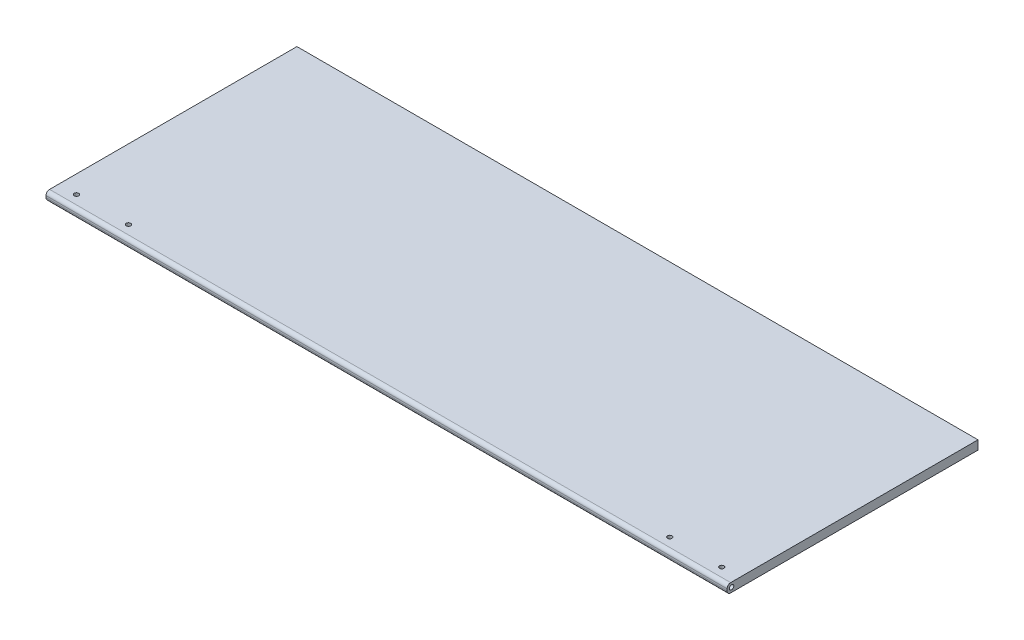
ISO-10303-21;
HEADER;
FILE_DESCRIPTION(('STEP AP214'),'2;1');
FILE_NAME('part.step','',(''),(''),'','','');
FILE_SCHEMA(('AUTOMOTIVE_DESIGN { 1 0 10303 214 1 1 1 1 }'));
ENDSEC;
DATA;
#1=APPLICATION_CONTEXT('core data for automotive mechanical design processes');
#2=APPLICATION_PROTOCOL_DEFINITION('international standard','automotive_design',2000,#1);
#3=PRODUCT_CONTEXT('',#1,'mechanical');
#4=PRODUCT('Part','Part','',(#3));
#5=PRODUCT_RELATED_PRODUCT_CATEGORY('part','',(#4));
#6=PRODUCT_DEFINITION_FORMATION('','',#4);
#7=PRODUCT_DEFINITION_CONTEXT('part definition',#1,'design');
#8=PRODUCT_DEFINITION('design','',#6,#7);
#9=PRODUCT_DEFINITION_SHAPE('','',#8);
#10=(LENGTH_UNIT() NAMED_UNIT(*) SI_UNIT(.MILLI.,.METRE.));
#11=(NAMED_UNIT(*) PLANE_ANGLE_UNIT() SI_UNIT($,.RADIAN.));
#12=(NAMED_UNIT(*) SI_UNIT($,.STERADIAN.) SOLID_ANGLE_UNIT());
#13=UNCERTAINTY_MEASURE_WITH_UNIT(LENGTH_MEASURE(1.E-05),#10,'distance_accuracy_value','');
#14=(GEOMETRIC_REPRESENTATION_CONTEXT(3) GLOBAL_UNCERTAINTY_ASSIGNED_CONTEXT((#13)) GLOBAL_UNIT_ASSIGNED_CONTEXT((#10,
#11,#12)) REPRESENTATION_CONTEXT('',''));
#15=CARTESIAN_POINT('',(0.,0.,0.));
#16=DIRECTION('',(0.,0.,1.));
#17=DIRECTION('',(1.,0.,0.));
#18=AXIS2_PLACEMENT_3D('',#15,#16,#17);
#19=CARTESIAN_POINT('',(60.325,3.96875,-22.8668008717622));
#20=DIRECTION('',(-1.,0.,0.));
#21=DIRECTION('',(0.,0.,1.));
#22=AXIS2_PLACEMENT_3D('',#19,#20,#21);
#23=PLANE('',#22);
#24=CARTESIAN_POINT('',(60.325,3.175,20.7894491282378));
#25=DIRECTION('',(-1.,0.,0.));
#26=DIRECTION('',(0.,0.,1.));
#27=AXIS2_PLACEMENT_3D('',#24,#25,#26);
#28=CIRCLE('',#27,0.396875);
#29=CARTESIAN_POINT('',(60.325,3.175,21.1863241282378));
#30=VERTEX_POINT('',#29);
#31=EDGE_CURVE('E140',#30,#30,#28,.T.);
#32=ORIENTED_EDGE('',*,*,#31,.T.);
#33=EDGE_LOOP('',(#32));
#34=FACE_BOUND('',#33,.T.);
#35=DIRECTION('',(0.,-1.,0.));
#36=VECTOR('',#35,1.);
#37=CARTESIAN_POINT('',(60.325,3.96875,21.5831991282378));
#38=LINE('',#37,#36);
#39=CARTESIAN_POINT('',(60.325,3.33375,21.5831991282378));
#40=VERTEX_POINT('',#39);
#41=CARTESIAN_POINT('',(60.325,3.01625,21.5831991282378));
#42=VERTEX_POINT('',#41);
#43=EDGE_CURVE('E136',#40,#42,#38,.T.);
#44=ORIENTED_EDGE('',*,*,#43,.T.);
#45=CARTESIAN_POINT('',(60.325,3.01625,20.9481991282378));
#46=DIRECTION('',(-1.,0.,0.));
#47=DIRECTION('',(0.,0.,1.));
#48=AXIS2_PLACEMENT_3D('',#45,#46,#47);
#49=CIRCLE('',#48,0.635);
#50=CARTESIAN_POINT('',(60.325,2.38125,20.9481991282378));
#51=VERTEX_POINT('',#50);
#52=EDGE_CURVE('E124',#42,#51,#49,.F.);
#53=ORIENTED_EDGE('',*,*,#52,.T.);
#54=DIRECTION('',(0.,0.,-1.));
#55=VECTOR('',#54,1.);
#56=CARTESIAN_POINT('',(60.325,2.38125,-22.8668008717622));
#57=LINE('',#56,#55);
#58=CARTESIAN_POINT('',(60.325,2.38125,-22.8668008717622));
#59=VERTEX_POINT('',#58);
#60=EDGE_CURVE('E110',#51,#59,#57,.T.);
#61=ORIENTED_EDGE('',*,*,#60,.T.);
#62=DIRECTION('',(0.,-1.,0.));
#63=VECTOR('',#62,1.);
#64=CARTESIAN_POINT('',(60.325,3.96875,-22.8668008717622));
#65=LINE('',#64,#63);
#66=CARTESIAN_POINT('',(60.325,3.96875,-22.8668008717622));
#67=VERTEX_POINT('',#66);
#68=EDGE_CURVE('E104',#67,#59,#65,.T.);
#69=ORIENTED_EDGE('',*,*,#68,.F.);
#70=DIRECTION('',(0.,0.,-1.));
#71=VECTOR('',#70,1.);
#72=CARTESIAN_POINT('',(60.325,3.96875,-22.8668008717622));
#73=LINE('',#72,#71);
#74=CARTESIAN_POINT('',(60.325,3.96875,20.9481991282378));
#75=VERTEX_POINT('',#74);
#76=EDGE_CURVE('E91',#75,#67,#73,.T.);
#77=ORIENTED_EDGE('',*,*,#76,.F.);
#78=CARTESIAN_POINT('',(60.325,3.33375,20.9481991282378));
#79=DIRECTION('',(-1.,0.,0.));
#80=DIRECTION('',(0.,0.,1.));
#81=AXIS2_PLACEMENT_3D('',#78,#79,#80);
#82=CIRCLE('',#81,0.635);
#83=EDGE_CURVE('E122',#75,#40,#82,.F.);
#84=ORIENTED_EDGE('',*,*,#83,.T.);
#85=EDGE_LOOP('',(#44,#53,#61,#69,#77,#84));
#86=FACE_BOUND('',#85,.T.);
#87=ADVANCED_FACE('F35',(#34,#86),#23,.F.);
#88=CARTESIAN_POINT('',(-60.325,3.96875,-22.8668008717622));
#89=DIRECTION('',(0.,0.,1.));
#90=DIRECTION('',(1.,0.,0.));
#91=AXIS2_PLACEMENT_3D('',#88,#89,#90);
#92=PLANE('',#91);
#93=DIRECTION('',(-1.,0.,0.));
#94=VECTOR('',#93,1.);
#95=CARTESIAN_POINT('',(-60.325,2.38125,-22.8668008717622));
#96=LINE('',#95,#94);
#97=CARTESIAN_POINT('',(-60.325,2.38125,-22.8668008717622));
#98=VERTEX_POINT('',#97);
#99=EDGE_CURVE('E139',#59,#98,#96,.T.);
#100=ORIENTED_EDGE('',*,*,#99,.T.);
#101=DIRECTION('',(0.,-1.,0.));
#102=VECTOR('',#101,1.);
#103=CARTESIAN_POINT('',(-60.325,3.96875,-22.8668008717622));
#104=LINE('',#103,#102);
#105=CARTESIAN_POINT('',(-60.325,3.96875,-22.8668008717622));
#106=VERTEX_POINT('',#105);
#107=EDGE_CURVE('E106',#106,#98,#104,.T.);
#108=ORIENTED_EDGE('',*,*,#107,.F.);
#109=DIRECTION('',(-1.,0.,0.));
#110=VECTOR('',#109,1.);
#111=CARTESIAN_POINT('',(-60.325,3.96875,-22.8668008717622));
#112=LINE('',#111,#110);
#113=EDGE_CURVE('E94',#67,#106,#112,.T.);
#114=ORIENTED_EDGE('',*,*,#113,.F.);
#115=ORIENTED_EDGE('',*,*,#68,.T.);
#116=EDGE_LOOP('',(#100,#108,#114,#115));
#117=FACE_BOUND('',#116,.T.);
#118=ADVANCED_FACE('F103',(#117),#92,.F.);
#119=CARTESIAN_POINT('',(-60.325,3.96875,-22.8668008717622));
#120=DIRECTION('',(1.,0.,0.));
#121=DIRECTION('',(0.,0.,-1.));
#122=AXIS2_PLACEMENT_3D('',#119,#120,#121);
#123=PLANE('',#122);
#124=CARTESIAN_POINT('',(-60.325,3.175,20.7894491282378));
#125=DIRECTION('',(-1.,0.,0.));
#126=DIRECTION('',(0.,0.,1.));
#127=AXIS2_PLACEMENT_3D('',#124,#125,#126);
#128=CIRCLE('',#127,0.396875);
#129=CARTESIAN_POINT('',(-60.325,3.175,21.1863241282378));
#130=VERTEX_POINT('',#129);
#131=EDGE_CURVE('E144',#130,#130,#128,.T.);
#132=ORIENTED_EDGE('',*,*,#131,.F.);
#133=EDGE_LOOP('',(#132));
#134=FACE_BOUND('',#133,.T.);
#135=DIRECTION('',(0.,0.,1.));
#136=VECTOR('',#135,1.);
#137=CARTESIAN_POINT('',(-60.325,2.38125,-22.8668008717622));
#138=LINE('',#137,#136);
#139=CARTESIAN_POINT('',(-60.325,2.38125,20.9481991282378));
#140=VERTEX_POINT('',#139);
#141=EDGE_CURVE('E99',#98,#140,#138,.T.);
#142=ORIENTED_EDGE('',*,*,#141,.T.);
#143=CARTESIAN_POINT('',(-60.325,3.01625,20.9481991282378));
#144=DIRECTION('',(1.,0.,0.));
#145=DIRECTION('',(0.,0.,-1.));
#146=AXIS2_PLACEMENT_3D('',#143,#144,#145);
#147=CIRCLE('',#146,0.635);
#148=CARTESIAN_POINT('',(-60.325,3.01625,21.5831991282378));
#149=VERTEX_POINT('',#148);
#150=EDGE_CURVE('E43',#140,#149,#147,.F.);
#151=ORIENTED_EDGE('',*,*,#150,.T.);
#152=DIRECTION('',(0.,-1.,0.));
#153=VECTOR('',#152,1.);
#154=CARTESIAN_POINT('',(-60.325,3.96875,21.5831991282378));
#155=LINE('',#154,#153);
#156=CARTESIAN_POINT('',(-60.325,3.33375,21.5831991282378));
#157=VERTEX_POINT('',#156);
#158=EDGE_CURVE('E116',#157,#149,#155,.T.);
#159=ORIENTED_EDGE('',*,*,#158,.F.);
#160=CARTESIAN_POINT('',(-60.325,3.33375,20.9481991282378));
#161=DIRECTION('',(1.,0.,0.));
#162=DIRECTION('',(0.,0.,-1.));
#163=AXIS2_PLACEMENT_3D('',#160,#161,#162);
#164=CIRCLE('',#163,0.635);
#165=CARTESIAN_POINT('',(-60.325,3.96875,20.9481991282378));
#166=VERTEX_POINT('',#165);
#167=EDGE_CURVE('E50',#157,#166,#164,.F.);
#168=ORIENTED_EDGE('',*,*,#167,.T.);
#169=DIRECTION('',(0.,0.,1.));
#170=VECTOR('',#169,1.);
#171=CARTESIAN_POINT('',(-60.325,3.96875,-22.8668008717622));
#172=LINE('',#171,#170);
#173=EDGE_CURVE('E107',#106,#166,#172,.T.);
#174=ORIENTED_EDGE('',*,*,#173,.F.);
#175=ORIENTED_EDGE('',*,*,#107,.T.);
#176=EDGE_LOOP('',(#142,#151,#159,#168,#174,#175));
#177=FACE_BOUND('',#176,.T.);
#178=ADVANCED_FACE('F129',(#134,#177),#123,.F.);
#179=CARTESIAN_POINT('',(-60.325,3.96875,21.5831991282378));
#180=DIRECTION('',(0.,0.,-1.));
#181=DIRECTION('',(-1.,0.,0.));
#182=AXIS2_PLACEMENT_3D('',#179,#180,#181);
#183=PLANE('',#182);
#184=ORIENTED_EDGE('',*,*,#158,.T.);
#185=DIRECTION('',(1.,0.,0.));
#186=VECTOR('',#185,1.);
#187=CARTESIAN_POINT('',(-60.325,3.01625,21.5831991282378));
#188=LINE('',#187,#186);
#189=EDGE_CURVE('E114',#149,#42,#188,.T.);
#190=ORIENTED_EDGE('',*,*,#189,.T.);
#191=ORIENTED_EDGE('',*,*,#43,.F.);
#192=DIRECTION('',(1.,0.,0.));
#193=VECTOR('',#192,1.);
#194=CARTESIAN_POINT('',(-60.325,3.33375,21.5831991282378));
#195=LINE('',#194,#193);
#196=EDGE_CURVE('E112',#40,#157,#195,.F.);
#197=ORIENTED_EDGE('',*,*,#196,.T.);
#198=EDGE_LOOP('',(#184,#190,#191,#197));
#199=FACE_BOUND('',#198,.T.);
#200=ADVANCED_FACE('F133',(#199),#183,.F.);
#201=CARTESIAN_POINT('',(0.,3.96875,-0.641800871762172));
#202=DIRECTION('',(0.,1.,0.));
#203=DIRECTION('',(0.,0.,1.));
#204=AXIS2_PLACEMENT_3D('',#201,#202,#203);
#205=PLANE('',#204);
#206=CARTESIAN_POINT('',(47.9425,3.96875,19.3606991282378));
#207=DIRECTION('',(0.,1.,0.));
#208=DIRECTION('',(0.,0.,-1.));
#209=AXIS2_PLACEMENT_3D('',#206,#207,#208);
#210=CIRCLE('',#209,0.396875000065981);
#211=CARTESIAN_POINT('',(47.9425,3.96875,18.9638241281718));
#212=VERTEX_POINT('',#211);
#213=EDGE_CURVE('E197',#212,#212,#210,.T.);
#214=ORIENTED_EDGE('',*,*,#213,.F.);
#215=EDGE_LOOP('',(#214));
#216=FACE_BOUND('',#215,.T.);
#217=CARTESIAN_POINT('',(57.15,3.96875,19.3606991282378));
#218=DIRECTION('',(0.,1.,0.));
#219=DIRECTION('',(0.,0.,-1.));
#220=AXIS2_PLACEMENT_3D('',#217,#218,#219);
#221=CIRCLE('',#220,0.396875000065981);
#222=CARTESIAN_POINT('',(57.15,3.96875,18.9638241281718));
#223=VERTEX_POINT('',#222);
#224=EDGE_CURVE('E201',#223,#223,#221,.T.);
#225=ORIENTED_EDGE('',*,*,#224,.F.);
#226=EDGE_LOOP('',(#225));
#227=FACE_BOUND('',#226,.T.);
#228=CARTESIAN_POINT('',(-47.9425,3.96875,19.3606991282378));
#229=DIRECTION('',(0.,-1.,0.));
#230=DIRECTION('',(0.,0.,-1.));
#231=AXIS2_PLACEMENT_3D('',#228,#229,#230);
#232=CIRCLE('',#231,0.396875000065981);
#233=CARTESIAN_POINT('',(-47.9425,3.96875,18.9638241281718));
#234=VERTEX_POINT('',#233);
#235=EDGE_CURVE('E211',#234,#234,#232,.T.);
#236=ORIENTED_EDGE('',*,*,#235,.T.);
#237=EDGE_LOOP('',(#236));
#238=FACE_BOUND('',#237,.T.);
#239=CARTESIAN_POINT('',(-57.15,3.96875,19.3606991282378));
#240=DIRECTION('',(0.,-1.,0.));
#241=DIRECTION('',(0.,0.,-1.));
#242=AXIS2_PLACEMENT_3D('',#239,#240,#241);
#243=CIRCLE('',#242,0.396875000065981);
#244=CARTESIAN_POINT('',(-57.15,3.96875,18.9638241281718));
#245=VERTEX_POINT('',#244);
#246=EDGE_CURVE('E217',#245,#245,#243,.T.);
#247=ORIENTED_EDGE('',*,*,#246,.T.);
#248=EDGE_LOOP('',(#247));
#249=FACE_BOUND('',#248,.T.);
#250=ORIENTED_EDGE('',*,*,#173,.T.);
#251=DIRECTION('',(1.,0.,0.));
#252=VECTOR('',#251,1.);
#253=CARTESIAN_POINT('',(60.325,3.96875,20.9481991282378));
#254=LINE('',#253,#252);
#255=EDGE_CURVE('E11',#166,#75,#254,.T.);
#256=ORIENTED_EDGE('',*,*,#255,.T.);
#257=ORIENTED_EDGE('',*,*,#76,.T.);
#258=ORIENTED_EDGE('',*,*,#113,.T.);
#259=EDGE_LOOP('',(#250,#256,#257,#258));
#260=FACE_BOUND('',#259,.T.);
#261=ADVANCED_FACE('F93',(#216,#227,#238,#249,#260),#205,.T.);
#262=CARTESIAN_POINT('',(0.,2.38125,-0.641800871762172));
#263=DIRECTION('',(0.,1.,0.));
#264=DIRECTION('',(0.,0.,1.));
#265=AXIS2_PLACEMENT_3D('',#262,#263,#264);
#266=PLANE('',#265);
#267=CARTESIAN_POINT('',(47.9425,2.38125,19.3606991282378));
#268=DIRECTION('',(0.,1.,0.));
#269=DIRECTION('',(0.,0.,-1.));
#270=AXIS2_PLACEMENT_3D('',#267,#268,#269);
#271=CIRCLE('',#270,0.396875000065981);
#272=CARTESIAN_POINT('',(47.9425,2.38125,18.9638241281718));
#273=VERTEX_POINT('',#272);
#274=EDGE_CURVE('E200',#273,#273,#271,.T.);
#275=ORIENTED_EDGE('',*,*,#274,.T.);
#276=EDGE_LOOP('',(#275));
#277=FACE_BOUND('',#276,.T.);
#278=CARTESIAN_POINT('',(57.15,2.38125,19.3606991282378));
#279=DIRECTION('',(0.,1.,0.));
#280=DIRECTION('',(0.,0.,-1.));
#281=AXIS2_PLACEMENT_3D('',#278,#279,#280);
#282=CIRCLE('',#281,0.396875000065981);
#283=CARTESIAN_POINT('',(57.15,2.38125,18.9638241281718));
#284=VERTEX_POINT('',#283);
#285=EDGE_CURVE('E206',#284,#284,#282,.T.);
#286=ORIENTED_EDGE('',*,*,#285,.T.);
#287=EDGE_LOOP('',(#286));
#288=FACE_BOUND('',#287,.T.);
#289=CARTESIAN_POINT('',(-47.9425,2.38125,19.3606991282378));
#290=DIRECTION('',(0.,-1.,0.));
#291=DIRECTION('',(0.,0.,-1.));
#292=AXIS2_PLACEMENT_3D('',#289,#290,#291);
#293=CIRCLE('',#292,0.396875000065981);
#294=CARTESIAN_POINT('',(-47.9425,2.38125,18.9638241281718));
#295=VERTEX_POINT('',#294);
#296=EDGE_CURVE('E214',#295,#295,#293,.T.);
#297=ORIENTED_EDGE('',*,*,#296,.F.);
#298=EDGE_LOOP('',(#297));
#299=FACE_BOUND('',#298,.T.);
#300=CARTESIAN_POINT('',(-57.15,2.38125,19.3606991282378));
#301=DIRECTION('',(0.,-1.,0.));
#302=DIRECTION('',(0.,0.,-1.));
#303=AXIS2_PLACEMENT_3D('',#300,#301,#302);
#304=CIRCLE('',#303,0.396875000065981);
#305=CARTESIAN_POINT('',(-57.15,2.38125,18.9638241281718));
#306=VERTEX_POINT('',#305);
#307=EDGE_CURVE('E203',#306,#306,#304,.T.);
#308=ORIENTED_EDGE('',*,*,#307,.F.);
#309=EDGE_LOOP('',(#308));
#310=FACE_BOUND('',#309,.T.);
#311=ORIENTED_EDGE('',*,*,#60,.F.);
#312=DIRECTION('',(1.,0.,0.));
#313=VECTOR('',#312,1.);
#314=CARTESIAN_POINT('',(0.,2.38125,20.9481991282378));
#315=LINE('',#314,#313);
#316=EDGE_CURVE('E58',#51,#140,#315,.F.);
#317=ORIENTED_EDGE('',*,*,#316,.T.);
#318=ORIENTED_EDGE('',*,*,#141,.F.);
#319=ORIENTED_EDGE('',*,*,#99,.F.);
#320=EDGE_LOOP('',(#311,#317,#318,#319));
#321=FACE_BOUND('',#320,.T.);
#322=ADVANCED_FACE('F138',(#277,#288,#299,#310,#321),#266,.F.);
#323=CARTESIAN_POINT('',(60.325,3.175,20.7894491282378));
#324=DIRECTION('',(-1.,0.,0.));
#325=DIRECTION('',(0.,0.,1.));
#326=AXIS2_PLACEMENT_3D('',#323,#324,#325);
#327=CYLINDRICAL_SURFACE('',#326,0.396875);
#328=ORIENTED_EDGE('',*,*,#31,.F.);
#329=EDGE_LOOP('',(#328));
#330=FACE_BOUND('',#329,.T.);
#331=ORIENTED_EDGE('',*,*,#131,.T.);
#332=EDGE_LOOP('',(#331));
#333=FACE_BOUND('',#332,.T.);
#334=ADVANCED_FACE('F159',(#330,#333),#327,.F.);
#335=CARTESIAN_POINT('',(-60.325,3.01625,20.9481991282378));
#336=DIRECTION('',(1.,0.,0.));
#337=DIRECTION('',(0.,0.,-1.));
#338=AXIS2_PLACEMENT_3D('',#335,#336,#337);
#339=CYLINDRICAL_SURFACE('',#338,0.635);
#340=ORIENTED_EDGE('',*,*,#150,.F.);
#341=ORIENTED_EDGE('',*,*,#316,.F.);
#342=ORIENTED_EDGE('',*,*,#52,.F.);
#343=ORIENTED_EDGE('',*,*,#189,.F.);
#344=EDGE_LOOP('',(#340,#341,#342,#343));
#345=FACE_BOUND('',#344,.T.);
#346=ADVANCED_FACE('F137',(#345),#339,.T.);
#347=CARTESIAN_POINT('',(0.,3.33375,20.9481991282378));
#348=DIRECTION('',(-1.,0.,0.));
#349=DIRECTION('',(0.,0.,1.));
#350=AXIS2_PLACEMENT_3D('',#347,#348,#349);
#351=CYLINDRICAL_SURFACE('',#350,0.635);
#352=ORIENTED_EDGE('',*,*,#167,.F.);
#353=ORIENTED_EDGE('',*,*,#196,.F.);
#354=ORIENTED_EDGE('',*,*,#83,.F.);
#355=ORIENTED_EDGE('',*,*,#255,.F.);
#356=EDGE_LOOP('',(#352,#353,#354,#355));
#357=FACE_BOUND('',#356,.T.);
#358=ADVANCED_FACE('F37',(#357),#351,.T.);
#359=CARTESIAN_POINT('',(-57.15,3.96875,19.3606991282378));
#360=DIRECTION('',(0.,-1.,0.));
#361=DIRECTION('',(0.,0.,-1.));
#362=AXIS2_PLACEMENT_3D('',#359,#360,#361);
#363=CYLINDRICAL_SURFACE('',#362,0.396875000065981);
#364=ORIENTED_EDGE('',*,*,#246,.F.);
#365=EDGE_LOOP('',(#364));
#366=FACE_BOUND('',#365,.T.);
#367=ORIENTED_EDGE('',*,*,#307,.T.);
#368=EDGE_LOOP('',(#367));
#369=FACE_BOUND('',#368,.T.);
#370=ADVANCED_FACE('F151',(#366,#369),#363,.F.);
#371=CARTESIAN_POINT('',(-47.9425,3.96875,19.3606991282378));
#372=DIRECTION('',(0.,-1.,0.));
#373=DIRECTION('',(0.,0.,-1.));
#374=AXIS2_PLACEMENT_3D('',#371,#372,#373);
#375=CYLINDRICAL_SURFACE('',#374,0.396875000065981);
#376=ORIENTED_EDGE('',*,*,#235,.F.);
#377=EDGE_LOOP('',(#376));
#378=FACE_BOUND('',#377,.T.);
#379=ORIENTED_EDGE('',*,*,#296,.T.);
#380=EDGE_LOOP('',(#379));
#381=FACE_BOUND('',#380,.T.);
#382=ADVANCED_FACE('F156',(#378,#381),#375,.F.);
#383=CARTESIAN_POINT('',(57.15,3.96875,19.3606991282378));
#384=DIRECTION('',(0.,-1.,0.));
#385=DIRECTION('',(0.,0.,-1.));
#386=AXIS2_PLACEMENT_3D('',#383,#384,#385);
#387=CYLINDRICAL_SURFACE('',#386,0.396875000065981);
#388=ORIENTED_EDGE('',*,*,#224,.T.);
#389=EDGE_LOOP('',(#388));
#390=FACE_BOUND('',#389,.T.);
#391=ORIENTED_EDGE('',*,*,#285,.F.);
#392=EDGE_LOOP('',(#391));
#393=FACE_BOUND('',#392,.T.);
#394=ADVANCED_FACE('F184',(#390,#393),#387,.F.);
#395=CARTESIAN_POINT('',(47.9425,3.96875,19.3606991282378));
#396=DIRECTION('',(0.,-1.,0.));
#397=DIRECTION('',(0.,0.,-1.));
#398=AXIS2_PLACEMENT_3D('',#395,#396,#397);
#399=CYLINDRICAL_SURFACE('',#398,0.396875000065981);
#400=ORIENTED_EDGE('',*,*,#213,.T.);
#401=EDGE_LOOP('',(#400));
#402=FACE_BOUND('',#401,.T.);
#403=ORIENTED_EDGE('',*,*,#274,.F.);
#404=EDGE_LOOP('',(#403));
#405=FACE_BOUND('',#404,.T.);
#406=ADVANCED_FACE('F188',(#402,#405),#399,.F.);
#407=CLOSED_SHELL('',(#87,#118,#178,#200,#261,#322,#334,#346,#358,#370,#382,#394,#406));
#408=MANIFOLD_SOLID_BREP('B2',#407);
#409=ADVANCED_BREP_SHAPE_REPRESENTATION('',(#18,#408),#14);
#410=SHAPE_DEFINITION_REPRESENTATION(#9,#409);
ENDSEC;
END-ISO-10303-21;
